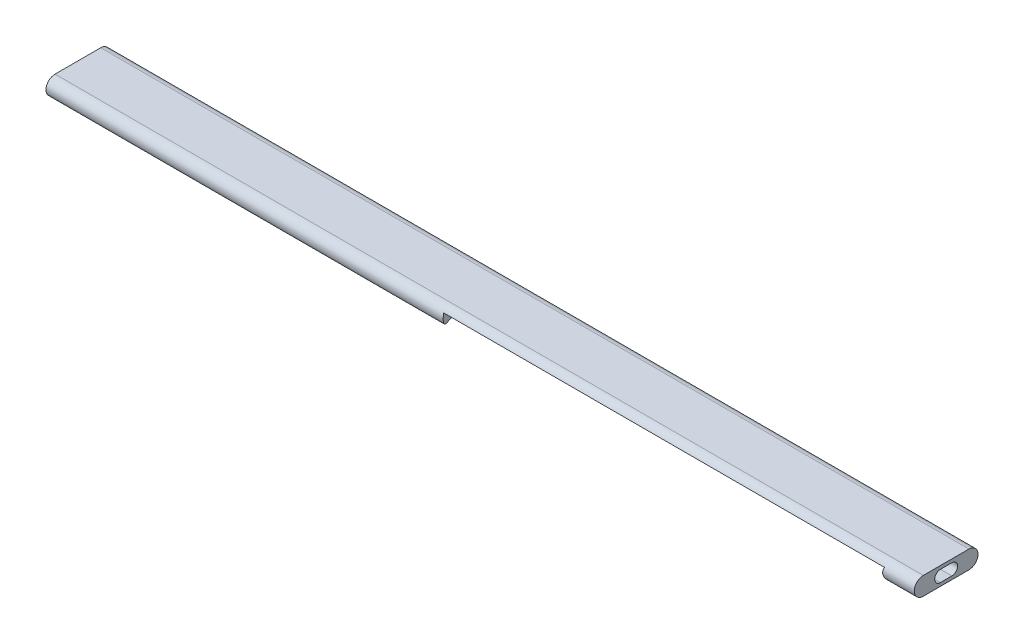
ISO-10303-21;
HEADER;
FILE_DESCRIPTION(('STEP AP214'),'2;1');
FILE_NAME('part.step','',(''),(''),'','','');
FILE_SCHEMA(('AUTOMOTIVE_DESIGN { 1 0 10303 214 1 1 1 1 }'));
ENDSEC;
DATA;
#1=APPLICATION_CONTEXT('core data for automotive mechanical design processes');
#2=APPLICATION_PROTOCOL_DEFINITION('international standard','automotive_design',2000,#1);
#3=PRODUCT_CONTEXT('',#1,'mechanical');
#4=PRODUCT('Part','Part','',(#3));
#5=PRODUCT_RELATED_PRODUCT_CATEGORY('part','',(#4));
#6=PRODUCT_DEFINITION_FORMATION('','',#4);
#7=PRODUCT_DEFINITION_CONTEXT('part definition',#1,'design');
#8=PRODUCT_DEFINITION('design','',#6,#7);
#9=PRODUCT_DEFINITION_SHAPE('','',#8);
#10=(LENGTH_UNIT() NAMED_UNIT(*) SI_UNIT(.MILLI.,.METRE.));
#11=(NAMED_UNIT(*) PLANE_ANGLE_UNIT() SI_UNIT($,.RADIAN.));
#12=(NAMED_UNIT(*) SI_UNIT($,.STERADIAN.) SOLID_ANGLE_UNIT());
#13=UNCERTAINTY_MEASURE_WITH_UNIT(LENGTH_MEASURE(1.E-05),#10,'distance_accuracy_value','');
#14=(GEOMETRIC_REPRESENTATION_CONTEXT(3) GLOBAL_UNCERTAINTY_ASSIGNED_CONTEXT((#13)) GLOBAL_UNIT_ASSIGNED_CONTEXT((#10,
#11,#12)) REPRESENTATION_CONTEXT('',''));
#15=CARTESIAN_POINT('',(0.,0.,0.));
#16=DIRECTION('',(0.,0.,1.));
#17=DIRECTION('',(1.,0.,0.));
#18=AXIS2_PLACEMENT_3D('',#15,#16,#17);
#19=CARTESIAN_POINT('',(380.,-3.95,10.));
#20=DIRECTION('',(0.,1.,0.));
#21=DIRECTION('',(0.,0.,1.));
#22=AXIS2_PLACEMENT_3D('',#19,#20,#21);
#23=PLANE('',#22);
#24=DIRECTION('',(-1.,0.,0.));
#25=VECTOR('',#24,1.);
#26=CARTESIAN_POINT('',(380.,-3.95,-10.));
#27=LINE('',#26,#25);
#28=CARTESIAN_POINT('',(171.899028265928,-3.95,-10.));
#29=VERTEX_POINT('',#28);
#30=CARTESIAN_POINT('',(0.,-3.95,-10.));
#31=VERTEX_POINT('',#30);
#32=EDGE_CURVE('E251',#29,#31,#27,.T.);
#33=ORIENTED_EDGE('',*,*,#32,.F.);
#34=CARTESIAN_POINT('',(197.278769414256,-3.95,0.));
#35=DIRECTION('',(0.,-1.,0.));
#36=DIRECTION('',(0.,0.,-1.));
#37=AXIS2_PLACEMENT_3D('',#34,#35,#36);
#38=CIRCLE('',#37,27.2787694142562);
#39=CARTESIAN_POINT('',(171.899028265928,-3.95,10.));
#40=VERTEX_POINT('',#39);
#41=EDGE_CURVE('E380',#40,#29,#38,.T.);
#42=ORIENTED_EDGE('',*,*,#41,.F.);
#43=DIRECTION('',(-1.,0.,0.));
#44=VECTOR('',#43,1.);
#45=CARTESIAN_POINT('',(380.,-3.95,10.));
#46=LINE('',#45,#44);
#47=CARTESIAN_POINT('',(0.,-3.95,10.));
#48=VERTEX_POINT('',#47);
#49=EDGE_CURVE('E256',#40,#48,#46,.T.);
#50=ORIENTED_EDGE('',*,*,#49,.T.);
#51=DIRECTION('',(0.,0.,-1.));
#52=VECTOR('',#51,1.);
#53=CARTESIAN_POINT('',(0.,-3.95,10.));
#54=LINE('',#53,#52);
#55=EDGE_CURVE('E235',#48,#31,#54,.T.);
#56=ORIENTED_EDGE('',*,*,#55,.T.);
#57=EDGE_LOOP('',(#33,#42,#50,#56));
#58=FACE_BOUND('',#57,.T.);
#59=ADVANCED_FACE('F41',(#58),#23,.F.);
#60=CARTESIAN_POINT('',(390.,-2.5,2.5));
#61=DIRECTION('',(0.,-1.,0.));
#62=DIRECTION('',(0.,0.,-1.));
#63=AXIS2_PLACEMENT_3D('',#60,#61,#62);
#64=PLANE('',#63);
#65=DIRECTION('',(-1.,0.,0.));
#66=VECTOR('',#65,1.);
#67=CARTESIAN_POINT('',(390.,-2.5,2.5));
#68=LINE('',#67,#66);
#69=CARTESIAN_POINT('',(170.11479951374,-2.5,2.5));
#70=VERTEX_POINT('',#69);
#71=CARTESIAN_POINT('',(0.,-2.5,2.5));
#72=VERTEX_POINT('',#71);
#73=EDGE_CURVE('E192',#70,#72,#68,.T.);
#74=ORIENTED_EDGE('',*,*,#73,.F.);
#75=CARTESIAN_POINT('',(197.278769414256,-2.5,0.));
#76=DIRECTION('',(0.,-1.,0.));
#77=DIRECTION('',(0.,0.,-1.));
#78=AXIS2_PLACEMENT_3D('',#75,#76,#77);
#79=CIRCLE('',#78,27.2787694142562);
#80=CARTESIAN_POINT('',(170.11479951374,-2.5,-2.5));
#81=VERTEX_POINT('',#80);
#82=EDGE_CURVE('E421',#70,#81,#79,.T.);
#83=ORIENTED_EDGE('',*,*,#82,.T.);
#84=DIRECTION('',(-1.,0.,0.));
#85=VECTOR('',#84,1.);
#86=CARTESIAN_POINT('',(390.,-2.5,-2.5));
#87=LINE('',#86,#85);
#88=CARTESIAN_POINT('',(0.,-2.5,-2.5));
#89=VERTEX_POINT('',#88);
#90=EDGE_CURVE('E179',#81,#89,#87,.T.);
#91=ORIENTED_EDGE('',*,*,#90,.T.);
#92=DIRECTION('',(0.,0.,1.));
#93=VECTOR('',#92,1.);
#94=CARTESIAN_POINT('',(0.,-2.5,2.5));
#95=LINE('',#94,#93);
#96=EDGE_CURVE('E202',#89,#72,#95,.T.);
#97=ORIENTED_EDGE('',*,*,#96,.T.);
#98=EDGE_LOOP('',(#74,#83,#91,#97));
#99=FACE_BOUND('',#98,.T.);
#100=ADVANCED_FACE('F343',(#99),#64,.F.);
#101=CARTESIAN_POINT('',(380.,0.,10.));
#102=DIRECTION('',(-1.,0.,0.));
#103=DIRECTION('',(0.,0.,1.));
#104=AXIS2_PLACEMENT_3D('',#101,#102,#103);
#105=CYLINDRICAL_SURFACE('',#104,3.95);
#106=ORIENTED_EDGE('',*,*,#49,.F.);
#107=CARTESIAN_POINT('',(171.899028265928,-3.95,10.));
#108=CARTESIAN_POINT('',(171.94674128855,-3.95000523238609,10.1211187317127));
#109=CARTESIAN_POINT('',(171.995330358066,-3.9444295975969,10.2418708423472));
#110=CARTESIAN_POINT('',(172.09385257495,-3.92235600871917,10.4817894590435));
#111=CARTESIAN_POINT('',(172.143785422067,-3.90586047543343,10.6009563105656));
#112=CARTESIAN_POINT('',(172.244596901927,-3.86219139743389,10.8368789028801));
#113=CARTESIAN_POINT('',(172.295475311013,-3.83502034796461,10.9536352003966));
#114=CARTESIAN_POINT('',(172.397734388173,-3.77028231577866,11.183973602497));
#115=CARTESIAN_POINT('',(172.44911508206,-3.73271479602158,11.2975555427724));
#116=CARTESIAN_POINT('',(172.603268953877,-3.6048581027437,11.6323267411303));
#117=CARTESIAN_POINT('',(172.70618488541,-3.4993577519449,11.8478462217603));
#118=CARTESIAN_POINT('',(172.90805457123,-3.25003463468524,12.2577234594721));
#119=CARTESIAN_POINT('',(173.007007293968,-3.10620196465932,12.4520757294727));
#120=CARTESIAN_POINT('',(173.148595003502,-2.86393416580665,12.7230665291524));
#121=CARTESIAN_POINT('',(173.19465826466,-2.77874091426116,12.8099874991171));
#122=CARTESIAN_POINT('',(173.283832055701,-2.59986807857697,12.9762518079893));
#123=CARTESIAN_POINT('',(173.326944016306,-2.50619265828871,13.0555988260325));
#124=CARTESIAN_POINT('',(173.409484945216,-2.31081793716902,13.2059033039564));
#125=CARTESIAN_POINT('',(173.448913762021,-2.20911830659543,13.2768604187676));
#126=CARTESIAN_POINT('',(173.523286880009,-1.99836133711601,13.4094775223418));
#127=CARTESIAN_POINT('',(173.558234101271,-1.88930886053115,13.4711435695308));
#128=CARTESIAN_POINT('',(173.619808669747,-1.67525220266821,13.5789661134543));
#129=CARTESIAN_POINT('',(173.646910845875,-1.57084604376579,13.6260391192927));
#130=CARTESIAN_POINT('',(173.696233608378,-1.35738822948463,13.7112249518945));
#131=CARTESIAN_POINT('',(173.718457073873,-1.24833935956832,13.7493430642301));
#132=CARTESIAN_POINT('',(173.757505518053,-1.02652600246015,13.8160377983434));
#133=CARTESIAN_POINT('',(173.774335379636,-0.913764978513517,13.8446230512974));
#134=CARTESIAN_POINT('',(173.802194670254,-0.685473884069953,13.8918125014772));
#135=CARTESIAN_POINT('',(173.813224980952,-0.569944237260241,13.9104182158278));
#136=CARTESIAN_POINT('',(173.828103657289,-0.353132763202182,13.9354840023348));
#137=CARTESIAN_POINT('',(173.832725444111,-0.252052920902555,13.9432529251376));
#138=CARTESIAN_POINT('',(173.837328262139,-0.0494938539442591,13.9509898848351));
#139=CARTESIAN_POINT('',(173.837309673664,0.0519853373026226,13.9509585610272));
#140=CARTESIAN_POINT('',(173.832629570373,0.254556887831461,13.9430918481801));
#141=CARTESIAN_POINT('',(173.827967130366,0.355649166000116,13.9352549040315));
#142=CARTESIAN_POINT('',(173.814103605482,0.556600384750887,13.9118974939058));
#143=CARTESIAN_POINT('',(173.804902631986,0.656459355537903,13.896377216485));
#144=CARTESIAN_POINT('',(173.771977610466,0.942364868622509,13.8406599668776));
#145=CARTESIAN_POINT('',(173.74261692358,1.12598031674771,13.7907956305916));
#146=CARTESIAN_POINT('',(173.670237902351,1.48142135595335,13.6665133000454));
#147=CARTESIAN_POINT('',(173.627240691102,1.6532646848382,13.5921332738497));
#148=CARTESIAN_POINT('',(173.565496102436,1.86232344651066,13.4837915116853));
#149=CARTESIAN_POINT('',(173.551888908336,1.90645500328914,13.4598365070957));
#150=CARTESIAN_POINT('',(173.537897387161,1.95,13.4351128074635));
#151=B_SPLINE_CURVE_WITH_KNOTS('',3,(#107,#108,#109,#110,#111,#112,#113,#114,#115,#116,#117,
#118,#119,#120,#121,#122,#123,#124,#125,#126,#127,#128,#129,#130,#131,#132,#133,#134,#135,#136,
#137,#138,#139,#140,#141,#142,#143,#144,#145,#146,#147,#148,#149,#150),.UNSPECIFIED.,.F.,.F.,(4,
2,2,2,2,2,2,2,2,2,2,2,2,2,2,2,2,2,2,2,2,4),(0.,0.390380266623746,0.78067401986901,
1.1708766019214,1.56109934405434,2.34054741739185,3.12019706503658,3.51016068812942,
3.89993390741033,4.28972315215218,4.67925711666276,5.03182248534673,5.38417922863565,
5.73621607180816,6.08819938190876,6.39225458123744,6.69628486063289,7.0003757239324,
7.30445912492237,7.87930867721528,8.45327209631667,8.60929695709322),.UNSPECIFIED.);
#152=CARTESIAN_POINT('',(173.537897387161,1.95000000000001,13.4351128074635));
#153=VERTEX_POINT('',#152);
#154=EDGE_CURVE('E319',#40,#153,#151,.T.);
#155=ORIENTED_EDGE('',*,*,#154,.T.);
#156=DIRECTION('',(-1.,0.,0.));
#157=VECTOR('',#156,1.);
#158=CARTESIAN_POINT('',(380.,1.95,13.4351128074635));
#159=LINE('',#158,#157);
#160=CARTESIAN_POINT('',(366.462102612839,1.95000000000001,13.4351128074635));
#161=VERTEX_POINT('',#160);
#162=EDGE_CURVE('E393',#161,#153,#159,.T.);
#163=ORIENTED_EDGE('',*,*,#162,.F.);
#164=CARTESIAN_POINT('',(366.462102612839,1.95000000000001,13.4351128074635));
#165=CARTESIAN_POINT('',(366.435073704957,1.86588388664957,13.4828731469988));
#166=CARTESIAN_POINT('',(366.409494828192,1.77963409448918,13.527738248058));
#167=CARTESIAN_POINT('',(366.361578612178,1.60327956076151,13.6113019665804));
#168=CARTESIAN_POINT('',(366.339242858871,1.51317296084808,13.6499975679514));
#169=CARTESIAN_POINT('',(366.298146183582,1.32944265276328,13.7208596761593));
#170=CARTESIAN_POINT('',(366.27939145948,1.23581317658926,13.7530148693241));
#171=CARTESIAN_POINT('',(366.245829345139,1.0457636207096,13.8103446566376));
#172=CARTESIAN_POINT('',(366.231021295946,0.949344009841717,13.8355204161328));
#173=CARTESIAN_POINT('',(366.205583399831,0.754034448327038,13.8786549722373));
#174=CARTESIAN_POINT('',(366.194966819444,0.655137691045773,13.8965908576739));
#175=CARTESIAN_POINT('',(366.1781854365,0.455853839393729,13.9248986309238));
#176=CARTESIAN_POINT('',(366.172022256645,0.355466215373857,13.9352677616241));
#177=CARTESIAN_POINT('',(366.164288336821,0.154201662419281,13.948274506382));
#178=CARTESIAN_POINT('',(366.162709074199,0.053325991277295,13.9509264686163));
#179=CARTESIAN_POINT('',(366.164151669254,-0.148335340322895,13.9485021958908));
#180=CARTESIAN_POINT('',(366.167175178586,-0.24912095547873,13.9434231867578));
#181=CARTESIAN_POINT('',(366.177514106687,-0.445023680964698,13.9260231875574));
#182=CARTESIAN_POINT('',(366.184619710339,-0.540183388322892,13.9140561795027));
#183=CARTESIAN_POINT('',(366.20281750844,-0.729022741478294,13.883322598727));
#184=CARTESIAN_POINT('',(366.213911108742,-0.822701853161008,13.8645536281507));
#185=CARTESIAN_POINT('',(366.252910775524,-1.10061808898435,13.7983323724339));
#186=CARTESIAN_POINT('',(366.28653975892,-1.28180713459832,13.7409590696802));
#187=CARTESIAN_POINT('',(366.36798918167,-1.63634469988218,13.6003229256638));
#188=CARTESIAN_POINT('',(366.416177873628,-1.80933562983281,13.5163852115264));
#189=CARTESIAN_POINT('',(366.523612957903,-2.13881861765676,13.3262807924677));
#190=CARTESIAN_POINT('',(366.582861294538,-2.29530776688849,13.2201101785392));
#191=CARTESIAN_POINT('',(366.71686563989,-2.60627225633237,12.9754499294513));
#192=CARTESIAN_POINT('',(366.792618414507,-2.75850497213527,12.8346602126917));
#193=CARTESIAN_POINT('',(366.950946655653,-3.0377059674885,12.5332014479548));
#194=CARTESIAN_POINT('',(367.033527074076,-3.16465567845233,12.3725179288019));
#195=CARTESIAN_POINT('',(367.212787564455,-3.4055641509139,12.0141474902066));
#196=CARTESIAN_POINT('',(367.309953736288,-3.51601297042641,11.8143396501289));
#197=CARTESIAN_POINT('',(367.50515092279,-3.70086610720061,11.3991718918987));
#198=CARTESIAN_POINT('',(367.603181578559,-3.77528472604527,11.1838181834862));
#199=CARTESIAN_POINT('',(367.768735941226,-3.87013829253791,10.8066184244436));
#200=CARTESIAN_POINT('',(367.836870375349,-3.8999665659416,10.647344474805));
#201=CARTESIAN_POINT('',(367.970853029373,-3.93988882513124,10.3256238994669));
#202=CARTESIAN_POINT('',(368.0367037941,-3.95000551936335,10.1631811426073));
#203=CARTESIAN_POINT('',(368.100971734072,-3.95,10.));
#204=B_SPLINE_CURVE_WITH_KNOTS('',3,(#164,#165,#166,#167,#168,#169,#170,#171,#172,#173,#174,
#175,#176,#177,#178,#179,#180,#181,#182,#183,#184,#185,#186,#187,#188,#189,#190,#191,#192,#193,
#194,#195,#196,#197,#198,#199,#200,#201,#202,#203),.UNSPECIFIED.,.F.,.F.,(4,2,2,2,2,2,2,2,2,2,2,
2,2,2,2,2,2,2,2,4),(0.,0.30125984151096,0.602666511731834,0.904590205800404,1.20646345766875,
1.5092846605661,1.81221614798948,2.11458404782802,2.41706047461442,2.70522690329465,
2.99349501654463,3.56981363062624,4.1621408044552,4.75457220932242,5.41421497592281,
6.07434043148531,6.81553335892462,7.55643184058619,8.08269749281811,8.60835650883405),.UNSPECIFIED.);
#205=CARTESIAN_POINT('',(368.100971734072,-3.95,10.));
#206=VERTEX_POINT('',#205);
#207=EDGE_CURVE('E296',#161,#206,#204,.T.);
#208=ORIENTED_EDGE('',*,*,#207,.T.);
#209=CARTESIAN_POINT('',(380.,-3.95,10.));
#210=VERTEX_POINT('',#209);
#211=EDGE_CURVE('E164',#210,#206,#46,.T.);
#212=ORIENTED_EDGE('',*,*,#211,.F.);
#213=CARTESIAN_POINT('',(380.,0.,10.));
#214=DIRECTION('',(1.,0.,0.));
#215=DIRECTION('',(0.,0.,-1.));
#216=AXIS2_PLACEMENT_3D('',#213,#214,#215);
#217=CIRCLE('',#216,3.95);
#218=CARTESIAN_POINT('',(380.,3.95,10.));
#219=VERTEX_POINT('',#218);
#220=EDGE_CURVE('E217',#219,#210,#217,.T.);
#221=ORIENTED_EDGE('',*,*,#220,.F.);
#222=DIRECTION('',(-1.,0.,0.));
#223=VECTOR('',#222,1.);
#224=CARTESIAN_POINT('',(380.,3.95,10.));
#225=LINE('',#224,#223);
#226=CARTESIAN_POINT('',(0.,3.95,10.));
#227=VERTEX_POINT('',#226);
#228=EDGE_CURVE('E231',#219,#227,#225,.T.);
#229=ORIENTED_EDGE('',*,*,#228,.T.);
#230=CARTESIAN_POINT('',(0.,0.,10.));
#231=DIRECTION('',(1.,0.,0.));
#232=DIRECTION('',(0.,0.,-1.));
#233=AXIS2_PLACEMENT_3D('',#230,#231,#232);
#234=CIRCLE('',#233,3.95);
#235=EDGE_CURVE('E216',#227,#48,#234,.T.);
#236=ORIENTED_EDGE('',*,*,#235,.T.);
#237=EDGE_LOOP('',(#106,#155,#163,#208,#212,#221,#229,#236));
#238=FACE_BOUND('',#237,.T.);
#239=ADVANCED_FACE('F43',(#238),#105,.T.);
#240=ORIENTED_EDGE('',*,*,#211,.T.);
#241=CARTESIAN_POINT('',(342.721230585744,-3.95,0.));
#242=DIRECTION('',(0.,-1.,0.));
#243=DIRECTION('',(0.,0.,-1.));
#244=AXIS2_PLACEMENT_3D('',#241,#242,#243);
#245=CIRCLE('',#244,27.2787694142562);
#246=CARTESIAN_POINT('',(368.100971734072,-3.95,-10.));
#247=VERTEX_POINT('',#246);
#248=EDGE_CURVE('E413',#247,#206,#245,.T.);
#249=ORIENTED_EDGE('',*,*,#248,.F.);
#250=CARTESIAN_POINT('',(380.,-3.95,-10.));
#251=VERTEX_POINT('',#250);
#252=EDGE_CURVE('E252',#251,#247,#27,.T.);
#253=ORIENTED_EDGE('',*,*,#252,.F.);
#254=DIRECTION('',(0.,0.,-1.));
#255=VECTOR('',#254,1.);
#256=CARTESIAN_POINT('',(380.,-3.95,10.));
#257=LINE('',#256,#255);
#258=EDGE_CURVE('E221',#210,#251,#257,.T.);
#259=ORIENTED_EDGE('',*,*,#258,.F.);
#260=EDGE_LOOP('',(#240,#249,#253,#259));
#261=FACE_BOUND('',#260,.T.);
#262=ADVANCED_FACE('F307',(#261),#23,.F.);
#263=CARTESIAN_POINT('',(380.,0.,-10.));
#264=DIRECTION('',(-1.,0.,0.));
#265=DIRECTION('',(0.,0.,1.));
#266=AXIS2_PLACEMENT_3D('',#263,#264,#265);
#267=CYLINDRICAL_SURFACE('',#266,3.95);
#268=DIRECTION('',(-1.,0.,0.));
#269=VECTOR('',#268,1.);
#270=CARTESIAN_POINT('',(380.,1.95,-13.4351128074635));
#271=LINE('',#270,#269);
#272=CARTESIAN_POINT('',(173.537897387161,1.95000000000001,-13.4351128074635));
#273=VERTEX_POINT('',#272);
#274=CARTESIAN_POINT('',(366.462102612839,1.95000000000001,-13.4351128074635));
#275=VERTEX_POINT('',#274);
#276=EDGE_CURVE('E391',#273,#275,#271,.F.);
#277=ORIENTED_EDGE('',*,*,#276,.F.);
#278=CARTESIAN_POINT('',(173.537897387161,1.95000000000001,-13.4351128074635));
#279=CARTESIAN_POINT('',(173.564926295043,1.86588388664957,-13.4828731469988));
#280=CARTESIAN_POINT('',(173.590505171808,1.77963409448918,-13.527738248058));
#281=CARTESIAN_POINT('',(173.638421387822,1.60327956076151,-13.6113019665804));
#282=CARTESIAN_POINT('',(173.660757141129,1.51317296084808,-13.6499975679514));
#283=CARTESIAN_POINT('',(173.701853816417,1.32944265276329,-13.7208596761593));
#284=CARTESIAN_POINT('',(173.72060854052,1.23581317658927,-13.7530148693241));
#285=CARTESIAN_POINT('',(173.75417065486,1.04576362070961,-13.8103446566376));
#286=CARTESIAN_POINT('',(173.768978704054,0.949344009841729,-13.8355204161328));
#287=CARTESIAN_POINT('',(173.794416600168,0.754034448327047,-13.8786549722373));
#288=CARTESIAN_POINT('',(173.805033180556,0.655137691045781,-13.8965908576739));
#289=CARTESIAN_POINT('',(173.8218145635,0.45585383939374,-13.9248986309238));
#290=CARTESIAN_POINT('',(173.827977743355,0.35546621537387,-13.9352677616241));
#291=CARTESIAN_POINT('',(173.835711663179,0.154201662419298,-13.948274506382));
#292=CARTESIAN_POINT('',(173.837290925801,0.0533259912773122,-13.9509264686163));
#293=CARTESIAN_POINT('',(173.835848330746,-0.148335340322876,-13.9485021958908));
#294=CARTESIAN_POINT('',(173.832824821414,-0.249120955478711,-13.9434231867578));
#295=CARTESIAN_POINT('',(173.822485893313,-0.445023680964676,-13.9260231875574));
#296=CARTESIAN_POINT('',(173.815380289661,-0.540183388322868,-13.9140561795027));
#297=CARTESIAN_POINT('',(173.79718249156,-0.729022741478267,-13.883322598727));
#298=CARTESIAN_POINT('',(173.786088891258,-0.82270185316098,-13.8645536281507));
#299=CARTESIAN_POINT('',(173.747089224476,-1.10061808898433,-13.7983323724339));
#300=CARTESIAN_POINT('',(173.71346024108,-1.2818071345983,-13.7409590696802));
#301=CARTESIAN_POINT('',(173.63201081833,-1.63634469988216,-13.6003229256639));
#302=CARTESIAN_POINT('',(173.583822126372,-1.8093356298328,-13.5163852115264));
#303=CARTESIAN_POINT('',(173.476387042097,-2.13881861765676,-13.3262807924677));
#304=CARTESIAN_POINT('',(173.417138705462,-2.29530776688847,-13.2201101785392));
#305=CARTESIAN_POINT('',(173.28313436011,-2.60627225633234,-12.9754499294513));
#306=CARTESIAN_POINT('',(173.207381585493,-2.75850497213525,-12.8346602126918));
#307=CARTESIAN_POINT('',(173.049053344347,-3.03770596748848,-12.5332014479548));
#308=CARTESIAN_POINT('',(172.966472925924,-3.16465567845232,-12.3725179288019));
#309=CARTESIAN_POINT('',(172.787212435545,-3.40556415091389,-12.0141474902066));
#310=CARTESIAN_POINT('',(172.690046263712,-3.5160129704264,-11.814339650129));
#311=CARTESIAN_POINT('',(172.49484907721,-3.7008661072006,-11.3991718918987));
#312=CARTESIAN_POINT('',(172.396818421441,-3.77528472604526,-11.1838181834863));
#313=CARTESIAN_POINT('',(172.231264058774,-3.8701382925379,-10.8066184244437));
#314=CARTESIAN_POINT('',(172.163129624651,-3.89996656594159,-10.647344474805));
#315=CARTESIAN_POINT('',(172.029146970627,-3.93988882513124,-10.325623899467));
#316=CARTESIAN_POINT('',(171.9632962059,-3.95000551936335,-10.1631811426073));
#317=CARTESIAN_POINT('',(171.899028265928,-3.95,-10.));
#318=B_SPLINE_CURVE_WITH_KNOTS('',3,(#278,#279,#280,#281,#282,#283,#284,#285,#286,#287,#288,
#289,#290,#291,#292,#293,#294,#295,#296,#297,#298,#299,#300,#301,#302,#303,#304,#305,#306,#307,
#308,#309,#310,#311,#312,#313,#314,#315,#316,#317),.UNSPECIFIED.,.F.,.F.,(4,2,2,2,2,2,2,2,2,2,2,
2,2,2,2,2,2,2,2,4),(0.,0.301259841510969,0.602666511731825,0.904590205800389,1.20646345766874,
1.50928466056609,1.81221614798947,2.114584047828,2.4170604746144,2.70522690329462,
2.99349501654459,3.56981363062622,4.16214080445518,4.75457220932241,5.41421497592278,
6.07434043148528,6.81553335892459,7.55643184058615,8.08269749281808,8.60835650883403),.UNSPECIFIED.);
#319=EDGE_CURVE('E170',#273,#29,#318,.T.);
#320=ORIENTED_EDGE('',*,*,#319,.T.);
#321=ORIENTED_EDGE('',*,*,#32,.T.);
#322=CARTESIAN_POINT('',(0.,0.,-10.));
#323=DIRECTION('',(1.,0.,0.));
#324=DIRECTION('',(0.,0.,-1.));
#325=AXIS2_PLACEMENT_3D('',#322,#323,#324);
#326=CIRCLE('',#325,3.95);
#327=CARTESIAN_POINT('',(0.,3.95,-10.));
#328=VERTEX_POINT('',#327);
#329=EDGE_CURVE('E239',#31,#328,#326,.T.);
#330=ORIENTED_EDGE('',*,*,#329,.T.);
#331=DIRECTION('',(-1.,0.,0.));
#332=VECTOR('',#331,1.);
#333=CARTESIAN_POINT('',(380.,3.95,-10.));
#334=LINE('',#333,#332);
#335=CARTESIAN_POINT('',(380.,3.95,-10.));
#336=VERTEX_POINT('',#335);
#337=EDGE_CURVE('E247',#336,#328,#334,.T.);
#338=ORIENTED_EDGE('',*,*,#337,.F.);
#339=CARTESIAN_POINT('',(380.,0.,-10.));
#340=DIRECTION('',(1.,0.,0.));
#341=DIRECTION('',(0.,0.,-1.));
#342=AXIS2_PLACEMENT_3D('',#339,#340,#341);
#343=CIRCLE('',#342,3.95);
#344=EDGE_CURVE('E225',#251,#336,#343,.T.);
#345=ORIENTED_EDGE('',*,*,#344,.F.);
#346=ORIENTED_EDGE('',*,*,#252,.T.);
#347=CARTESIAN_POINT('',(368.100971734072,-3.95,-10.));
#348=CARTESIAN_POINT('',(368.05325871145,-3.95000523238608,-10.1211187317127));
#349=CARTESIAN_POINT('',(368.004669641934,-3.9444295975969,-10.2418708423473));
#350=CARTESIAN_POINT('',(367.90614742505,-3.92235600871916,-10.4817894590435));
#351=CARTESIAN_POINT('',(367.856214577933,-3.90586047543342,-10.6009563105656));
#352=CARTESIAN_POINT('',(367.755403098073,-3.86219139743388,-10.8368789028801));
#353=CARTESIAN_POINT('',(367.704524688987,-3.8350203479646,-10.9536352003966));
#354=CARTESIAN_POINT('',(367.602265611827,-3.77028231577865,-11.183973602497));
#355=CARTESIAN_POINT('',(367.55088491794,-3.73271479602157,-11.2975555427724));
#356=CARTESIAN_POINT('',(367.396731046123,-3.60485810274369,-11.6323267411303));
#357=CARTESIAN_POINT('',(367.29381511459,-3.49935775194487,-11.8478462217604));
#358=CARTESIAN_POINT('',(367.09194542877,-3.25003463468521,-12.2577234594721));
#359=CARTESIAN_POINT('',(366.992992706032,-3.1062019646593,-12.4520757294727));
#360=CARTESIAN_POINT('',(366.851404996498,-2.86393416580664,-12.7230665291524));
#361=CARTESIAN_POINT('',(366.80534173534,-2.77874091426115,-12.8099874991171));
#362=CARTESIAN_POINT('',(366.716167944299,-2.59986807857696,-12.9762518079893));
#363=CARTESIAN_POINT('',(366.673055983694,-2.50619265828871,-13.0555988260325));
#364=CARTESIAN_POINT('',(366.590515054784,-2.31081793716902,-13.2059033039564));
#365=CARTESIAN_POINT('',(366.551086237979,-2.20911830659543,-13.2768604187676));
#366=CARTESIAN_POINT('',(366.476713119991,-1.998361337116,-13.4094775223418));
#367=CARTESIAN_POINT('',(366.441765898729,-1.88930886053114,-13.4711435695308));
#368=CARTESIAN_POINT('',(366.380191330253,-1.67525220266821,-13.5789661134543));
#369=CARTESIAN_POINT('',(366.353089154125,-1.57084604376578,-13.6260391192927));
#370=CARTESIAN_POINT('',(366.303766391622,-1.35738822948462,-13.7112249518945));
#371=CARTESIAN_POINT('',(366.281542926127,-1.24833935956831,-13.7493430642301));
#372=CARTESIAN_POINT('',(366.242494481947,-1.02652600246015,-13.8160377983434));
#373=CARTESIAN_POINT('',(366.225664620364,-0.913764978513512,-13.8446230512974));
#374=CARTESIAN_POINT('',(366.197805329746,-0.685473884069947,-13.8918125014772));
#375=CARTESIAN_POINT('',(366.186775019048,-0.569944237260232,-13.9104182158278));
#376=CARTESIAN_POINT('',(366.171896342711,-0.353132763202171,-13.9354840023348));
#377=CARTESIAN_POINT('',(366.167274555889,-0.252052920902544,-13.9432529251376));
#378=CARTESIAN_POINT('',(366.162671737861,-0.0494938539442475,-13.9509898848351));
#379=CARTESIAN_POINT('',(366.162690326336,0.051985337302635,-13.9509585610272));
#380=CARTESIAN_POINT('',(366.167370429627,0.254556887831472,-13.9430918481801));
#381=CARTESIAN_POINT('',(366.172032869634,0.355649166000126,-13.9352549040315));
#382=CARTESIAN_POINT('',(366.185896394518,0.556600384750898,-13.9118974939058));
#383=CARTESIAN_POINT('',(366.195097368014,0.656459355537918,-13.896377216485));
#384=CARTESIAN_POINT('',(366.228022389534,0.942364868622525,-13.8406599668776));
#385=CARTESIAN_POINT('',(366.25738307642,1.12598031674772,-13.7907956305916));
#386=CARTESIAN_POINT('',(366.329762097649,1.48142135595336,-13.6665133000454));
#387=CARTESIAN_POINT('',(366.372759308898,1.65326468483822,-13.5921332738497));
#388=CARTESIAN_POINT('',(366.434503897564,1.86232344651067,-13.4837915116853));
#389=CARTESIAN_POINT('',(366.448111091664,1.90645500328916,-13.4598365070957));
#390=CARTESIAN_POINT('',(366.462102612839,1.95000000000001,-13.4351128074635));
#391=B_SPLINE_CURVE_WITH_KNOTS('',3,(#347,#348,#349,#350,#351,#352,#353,#354,#355,#356,#357,
#358,#359,#360,#361,#362,#363,#364,#365,#366,#367,#368,#369,#370,#371,#372,#373,#374,#375,#376,
#377,#378,#379,#380,#381,#382,#383,#384,#385,#386,#387,#388,#389,#390),.UNSPECIFIED.,.F.,.F.,(4,
2,2,2,2,2,2,2,2,2,2,2,2,2,2,2,2,2,2,2,2,4),(0.,0.390380266623766,0.780674019869029,
1.17087660192143,1.56109934405436,2.34054741739194,3.12019706503657,3.51016068812944,
3.89993390741032,4.28972315215217,4.67925711666276,5.03182248534673,5.38417922863565,
5.73621607180816,6.08819938190876,6.39225458123744,6.6962848606329,7.0003757239324,
7.30445912492237,7.87930867721529,8.45327209631667,8.60929695709321),.UNSPECIFIED.);
#392=EDGE_CURVE('E288',#247,#275,#391,.T.);
#393=ORIENTED_EDGE('',*,*,#392,.T.);
#394=EDGE_LOOP('',(#277,#320,#321,#330,#338,#345,#346,#393));
#395=FACE_BOUND('',#394,.T.);
#396=ADVANCED_FACE('F302',(#395),#267,.T.);
#397=CARTESIAN_POINT('',(380.,3.95,10.));
#398=DIRECTION('',(0.,-1.,0.));
#399=DIRECTION('',(0.,0.,-1.));
#400=AXIS2_PLACEMENT_3D('',#397,#398,#399);
#401=PLANE('',#400);
#402=DIRECTION('',(0.,0.,1.));
#403=VECTOR('',#402,1.);
#404=CARTESIAN_POINT('',(0.,3.95,10.));
#405=LINE('',#404,#403);
#406=EDGE_CURVE('E222',#328,#227,#405,.T.);
#407=ORIENTED_EDGE('',*,*,#406,.T.);
#408=ORIENTED_EDGE('',*,*,#228,.F.);
#409=DIRECTION('',(0.,0.,1.));
#410=VECTOR('',#409,1.);
#411=CARTESIAN_POINT('',(380.,3.95,10.));
#412=LINE('',#411,#410);
#413=EDGE_CURVE('E228',#336,#219,#412,.T.);
#414=ORIENTED_EDGE('',*,*,#413,.F.);
#415=ORIENTED_EDGE('',*,*,#337,.T.);
#416=EDGE_LOOP('',(#407,#408,#414,#415));
#417=FACE_BOUND('',#416,.T.);
#418=ADVANCED_FACE('F306',(#417),#401,.F.);
#419=CARTESIAN_POINT('',(380.,0.,10.));
#420=DIRECTION('',(1.,0.,0.));
#421=DIRECTION('',(0.,0.,-1.));
#422=AXIS2_PLACEMENT_3D('',#419,#420,#421);
#423=PLANE('',#422);
#424=CARTESIAN_POINT('',(380.,0.,2.5));
#425=DIRECTION('',(1.,0.,0.));
#426=DIRECTION('',(0.,0.,-1.));
#427=AXIS2_PLACEMENT_3D('',#424,#425,#426);
#428=CIRCLE('',#427,2.5);
#429=CARTESIAN_POINT('',(380.,2.5,2.5));
#430=VERTEX_POINT('',#429);
#431=CARTESIAN_POINT('',(380.,-2.5,2.5));
#432=VERTEX_POINT('',#431);
#433=EDGE_CURVE('E213',#430,#432,#428,.T.);
#434=ORIENTED_EDGE('',*,*,#433,.F.);
#435=DIRECTION('',(0.,0.,1.));
#436=VECTOR('',#435,1.);
#437=CARTESIAN_POINT('',(380.,2.5,10.));
#438=LINE('',#437,#436);
#439=CARTESIAN_POINT('',(380.,2.5,-2.5));
#440=VERTEX_POINT('',#439);
#441=EDGE_CURVE('E203',#440,#430,#438,.T.);
#442=ORIENTED_EDGE('',*,*,#441,.F.);
#443=CARTESIAN_POINT('',(380.,0.,-2.5));
#444=DIRECTION('',(1.,0.,0.));
#445=DIRECTION('',(0.,0.,-1.));
#446=AXIS2_PLACEMENT_3D('',#443,#444,#445);
#447=CIRCLE('',#446,2.5);
#448=CARTESIAN_POINT('',(380.,-2.5,-2.5));
#449=VERTEX_POINT('',#448);
#450=EDGE_CURVE('E206',#449,#440,#447,.T.);
#451=ORIENTED_EDGE('',*,*,#450,.F.);
#452=DIRECTION('',(0.,0.,-1.));
#453=VECTOR('',#452,1.);
#454=CARTESIAN_POINT('',(380.,-2.5,10.));
#455=LINE('',#454,#453);
#456=EDGE_CURVE('E210',#432,#449,#455,.T.);
#457=ORIENTED_EDGE('',*,*,#456,.F.);
#458=EDGE_LOOP('',(#434,#442,#451,#457));
#459=FACE_BOUND('',#458,.T.);
#460=ORIENTED_EDGE('',*,*,#220,.T.);
#461=ORIENTED_EDGE('',*,*,#258,.T.);
#462=ORIENTED_EDGE('',*,*,#344,.T.);
#463=ORIENTED_EDGE('',*,*,#413,.T.);
#464=EDGE_LOOP('',(#460,#461,#462,#463));
#465=FACE_BOUND('',#464,.T.);
#466=ADVANCED_FACE('F359',(#459,#465),#423,.T.);
#467=CARTESIAN_POINT('',(0.,0.,10.));
#468=DIRECTION('',(1.,0.,0.));
#469=DIRECTION('',(0.,0.,-1.));
#470=AXIS2_PLACEMENT_3D('',#467,#468,#469);
#471=PLANE('',#470);
#472=DIRECTION('',(0.,0.,-1.));
#473=VECTOR('',#472,1.);
#474=CARTESIAN_POINT('',(0.,2.5,2.5));
#475=LINE('',#474,#473);
#476=CARTESIAN_POINT('',(0.,2.5,2.5));
#477=VERTEX_POINT('',#476);
#478=CARTESIAN_POINT('',(0.,2.5,-2.5));
#479=VERTEX_POINT('',#478);
#480=EDGE_CURVE('E335',#477,#479,#475,.T.);
#481=ORIENTED_EDGE('',*,*,#480,.F.);
#482=CARTESIAN_POINT('',(0.,0.,2.5));
#483=DIRECTION('',(-1.,0.,0.));
#484=DIRECTION('',(0.,0.,1.));
#485=AXIS2_PLACEMENT_3D('',#482,#483,#484);
#486=CIRCLE('',#485,2.5);
#487=EDGE_CURVE('E332',#72,#477,#486,.T.);
#488=ORIENTED_EDGE('',*,*,#487,.F.);
#489=ORIENTED_EDGE('',*,*,#96,.F.);
#490=CARTESIAN_POINT('',(0.,0.,-2.5));
#491=DIRECTION('',(-1.,0.,0.));
#492=DIRECTION('',(0.,0.,1.));
#493=AXIS2_PLACEMENT_3D('',#490,#491,#492);
#494=CIRCLE('',#493,2.5);
#495=EDGE_CURVE('E181',#479,#89,#494,.T.);
#496=ORIENTED_EDGE('',*,*,#495,.F.);
#497=EDGE_LOOP('',(#481,#488,#489,#496));
#498=FACE_BOUND('',#497,.T.);
#499=ORIENTED_EDGE('',*,*,#235,.F.);
#500=ORIENTED_EDGE('',*,*,#406,.F.);
#501=ORIENTED_EDGE('',*,*,#329,.F.);
#502=ORIENTED_EDGE('',*,*,#55,.F.);
#503=EDGE_LOOP('',(#499,#500,#501,#502));
#504=FACE_BOUND('',#503,.T.);
#505=ADVANCED_FACE('F346',(#498,#504),#471,.F.);
#506=CARTESIAN_POINT('',(390.,0.,2.5));
#507=DIRECTION('',(-1.,0.,0.));
#508=DIRECTION('',(0.,0.,1.));
#509=AXIS2_PLACEMENT_3D('',#506,#507,#508);
#510=CYLINDRICAL_SURFACE('',#509,2.5);
#511=DIRECTION('',(-1.,0.,0.));
#512=VECTOR('',#511,1.);
#513=CARTESIAN_POINT('',(390.,1.95,4.0644487847162));
#514=LINE('',#513,#512);
#515=CARTESIAN_POINT('',(170.30449432052,1.95000000000001,4.0644487847162));
#516=VERTEX_POINT('',#515);
#517=CARTESIAN_POINT('',(369.69550567948,1.95000000000001,4.0644487847162));
#518=VERTEX_POINT('',#517);
#519=EDGE_CURVE('E173',#516,#518,#514,.F.);
#520=ORIENTED_EDGE('',*,*,#519,.F.);
#521=CARTESIAN_POINT('',(170.30449432052,1.95000000000001,4.06444878471619));
#522=CARTESIAN_POINT('',(170.312735682314,1.90611598904194,4.11914600494327));
#523=CARTESIAN_POINT('',(170.320867381618,1.85994348113145,4.17198136651587));
#524=CARTESIAN_POINT('',(170.336792560506,1.76329612459643,4.27361506366697));
#525=CARTESIAN_POINT('',(170.344586034416,1.71282120384846,4.32241333154266));
#526=CARTESIAN_POINT('',(170.367265760088,1.55545843226576,4.46218988280483));
#527=CARTESIAN_POINT('',(170.381467678085,1.44254681655901,4.54665667013422));
#528=CARTESIAN_POINT('',(170.407062381104,1.20386957388986,4.69556920084272));
#529=CARTESIAN_POINT('',(170.418452925565,1.07809380685268,4.7599989860353));
#530=CARTESIAN_POINT('',(170.437603301795,0.817286489515317,4.86682860411321));
#531=CARTESIAN_POINT('',(170.445364736011,0.682259054577891,4.90923816102739));
#532=CARTESIAN_POINT('',(170.456623153293,0.408295105338551,4.97038208974476));
#533=CARTESIAN_POINT('',(170.460164788213,0.269415729630704,4.9893644352118));
#534=CARTESIAN_POINT('',(170.462869604211,-0.00962980421574739,5.00388213114154));
#535=CARTESIAN_POINT('',(170.462032208991,-0.14979612929912,4.99941439547479));
#536=CARTESIAN_POINT('',(170.456071436118,-0.425904175526209,4.96733213687316));
#537=CARTESIAN_POINT('',(170.450991766113,-0.561874374040078,4.93995365487946));
#538=CARTESIAN_POINT('',(170.436974234527,-0.827236758077521,4.86320887230885));
#539=CARTESIAN_POINT('',(170.428036565749,-0.956629271960447,4.81384367051673));
#540=CARTESIAN_POINT('',(170.406880788294,-1.20590433616154,4.69430992737422));
#541=CARTESIAN_POINT('',(170.394646839906,-1.32573724794322,4.62404076124209));
#542=CARTESIAN_POINT('',(170.367747749717,-1.55196469058919,4.4648260198266));
#543=CARTESIAN_POINT('',(170.353082469081,-1.65835845343171,4.37587937793372));
#544=CARTESIAN_POINT('',(170.322032615504,-1.85633535456044,4.18037306862678));
#545=CARTESIAN_POINT('',(170.305626182352,-1.94768117796629,4.07357655249501));
#546=CARTESIAN_POINT('',(170.272270772664,-2.11122761789426,3.84622813051304));
#547=CARTESIAN_POINT('',(170.255321604157,-2.18342137437967,3.72567131794719));
#548=CARTESIAN_POINT('',(170.22165700063,-2.307314382817,3.47280426537281));
#549=CARTESIAN_POINT('',(170.204946031835,-2.35878516389392,3.34038168597491));
#550=CARTESIAN_POINT('',(170.172811029199,-2.43855755055587,3.06869710124822));
#551=CARTESIAN_POINT('',(170.157385119242,-2.46689348360991,2.9294455554082));
#552=CARTESIAN_POINT('',(170.138007503667,-2.48883518546855,2.74092299065879));
#553=CARTESIAN_POINT('',(170.133191445425,-2.49302297408848,2.69280764554062));
#554=CARTESIAN_POINT('',(170.123808151852,-2.49860172594516,2.59647229221184));
#555=CARTESIAN_POINT('',(170.119240514268,-2.49999734999474,2.54825259314855));
#556=CARTESIAN_POINT('',(170.11479951374,-2.5,2.5));
#557=B_SPLINE_CURVE_WITH_KNOTS('',3,(#521,#522,#523,#524,#525,#526,#527,#528,#529,#530,#531,
#532,#533,#534,#535,#536,#537,#538,#539,#540,#541,#542,#543,#544,#545,#546,#547,#548,#549,#550,
#551,#552,#553,#554,#555,#556),.UNSPECIFIED.,.F.,.F.,(4,2,2,2,2,2,2,2,2,2,2,2,2,2,2,2,2,4),(0.,
0.211696940603534,0.42339743068428,0.84638988949358,1.26971837696744,1.69285976524868,
2.11148274643236,2.53016082154491,2.94457776921678,3.35897400875404,3.77539821366604,
4.19184620567249,4.61433715038948,5.03697922250491,5.46416109392734,5.89070795534564,
6.03625831143783,6.18156550461671),.UNSPECIFIED.);
#558=EDGE_CURVE('E320',#516,#70,#557,.T.);
#559=ORIENTED_EDGE('',*,*,#558,.T.);
#560=ORIENTED_EDGE('',*,*,#73,.T.);
#561=ORIENTED_EDGE('',*,*,#487,.T.);
#562=DIRECTION('',(-1.,0.,0.));
#563=VECTOR('',#562,1.);
#564=CARTESIAN_POINT('',(390.,2.5,2.5));
#565=LINE('',#564,#563);
#566=EDGE_CURVE('E193',#430,#477,#565,.T.);
#567=ORIENTED_EDGE('',*,*,#566,.F.);
#568=ORIENTED_EDGE('',*,*,#433,.T.);
#569=CARTESIAN_POINT('',(369.88520048626,-2.5,2.5));
#570=VERTEX_POINT('',#569);
#571=EDGE_CURVE('E196',#432,#570,#68,.T.);
#572=ORIENTED_EDGE('',*,*,#571,.T.);
#573=CARTESIAN_POINT('',(369.88520048626,-2.5,2.5));
#574=CARTESIAN_POINT('',(369.878691280701,-2.50000669130583,2.57075574330113));
#575=CARTESIAN_POINT('',(369.871900726663,-2.49699623427627,2.64148108627104));
#576=CARTESIAN_POINT('',(369.85782325246,-2.48500656353339,2.78236808995822));
#577=CARTESIAN_POINT('',(369.850536377186,-2.47602788898603,2.85252980101431));
#578=CARTESIAN_POINT('',(369.835537952127,-2.45217773312621,2.99173872987611));
#579=CARTESIAN_POINT('',(369.827826779263,-2.43731141154964,3.06078686858449));
#580=CARTESIAN_POINT('',(369.812061217361,-2.40181595211312,3.19732535147188));
#581=CARTESIAN_POINT('',(369.804006828256,-2.38118681312344,3.26481569534549));
#582=CARTESIAN_POINT('',(369.779462273744,-2.31084447928501,3.46427833329703));
#583=CARTESIAN_POINT('',(369.762581118314,-2.25266114375393,3.59333047368969));
#584=CARTESIAN_POINT('',(369.72870116142,-2.11544488863521,3.83970254808045));
#585=CARTESIAN_POINT('',(369.711702370437,-2.03641380379874,3.95702351325355));
#586=CARTESIAN_POINT('',(369.678504841729,-1.8593000013158,4.17720911137664));
#587=CARTESIAN_POINT('',(369.662309479205,-1.76114425472434,4.28001563884339));
#588=CARTESIAN_POINT('',(369.631828416702,-1.54867031772444,4.46766731156774));
#589=CARTESIAN_POINT('',(369.617542912154,-1.43435047573752,4.55251061920495));
#590=CARTESIAN_POINT('',(369.591934014743,-1.19340016546381,4.70130263391789));
#591=CARTESIAN_POINT('',(369.580594892021,-1.06684023719571,4.76536277239693));
#592=CARTESIAN_POINT('',(369.561594637799,-0.804486710849929,4.87124541193391));
#593=CARTESIAN_POINT('',(369.553932963918,-0.668694477800641,4.9130711923893));
#594=CARTESIAN_POINT('',(369.542941610082,-0.393849766345057,4.97272495163371));
#595=CARTESIAN_POINT('',(369.539550314963,-0.254873835128166,4.99089438947315));
#596=CARTESIAN_POINT('',(369.537148999009,0.0241904099467988,5.00378129150061));
#597=CARTESIAN_POINT('',(369.538138541255,0.164278611482916,4.99850109440968));
#598=CARTESIAN_POINT('',(369.544391170535,0.440109257967529,4.96483620894814));
#599=CARTESIAN_POINT('',(369.549611134775,0.575881254740881,4.93668465257431));
#600=CARTESIAN_POINT('',(369.563892998064,0.840774992919,4.85842588581108));
#601=CARTESIAN_POINT('',(369.572956100494,0.969894637093418,4.80831179824609));
#602=CARTESIAN_POINT('',(369.59434399067,1.21858342156796,4.68730435214951));
#603=CARTESIAN_POINT('',(369.606686996725,1.33809420393175,4.61629468438877));
#604=CARTESIAN_POINT('',(369.633768448707,1.56345083501388,4.45568720380247));
#605=CARTESIAN_POINT('',(369.64850366593,1.66931476174925,4.36611440070372));
#606=CARTESIAN_POINT('',(369.669077411092,1.79930911438037,4.23625901105168));
#607=CARTESIAN_POINT('',(369.674283909298,1.8307995419469,4.20301885892984));
#608=CARTESIAN_POINT('',(369.684813276853,1.89184633774632,4.13493076339971));
#609=CARTESIAN_POINT('',(369.690135927894,1.92140597671191,4.10008571895122));
#610=CARTESIAN_POINT('',(369.69550567948,1.95000000000002,4.06444878471621));
#611=B_SPLINE_CURVE_WITH_KNOTS('',3,(#573,#574,#575,#576,#577,#578,#579,#580,#581,#582,#583,
#584,#585,#586,#587,#588,#589,#590,#591,#592,#593,#594,#595,#596,#597,#598,#599,#600,#601,#602,
#603,#604,#605,#606,#607,#608,#609,#610),.UNSPECIFIED.,.F.,.F.,(4,2,2,2,2,2,2,2,2,2,2,2,2,2,2,2,
2,2,4),(0.,0.213091592190615,0.426163936402709,0.639049962916725,0.851936031164538,
1.27744138804016,1.70290930988435,2.13003493279946,2.55720422917217,2.98204382953902,
3.40682075192208,3.8253958057352,4.24392911440781,4.65824897678035,5.07269866884187,
5.48950037976103,5.9057441510948,6.04394438992027,6.18190409898238),.UNSPECIFIED.);
#612=EDGE_CURVE('E280',#570,#518,#611,.T.);
#613=ORIENTED_EDGE('',*,*,#612,.T.);
#614=EDGE_LOOP('',(#520,#559,#560,#561,#567,#568,#572,#613));
#615=FACE_BOUND('',#614,.T.);
#616=ADVANCED_FACE('F351',(#615),#510,.F.);
#617=CARTESIAN_POINT('',(369.88520048626,-2.5,-2.5));
#618=VERTEX_POINT('',#617);
#619=EDGE_CURVE('E186',#449,#618,#87,.T.);
#620=ORIENTED_EDGE('',*,*,#619,.T.);
#621=CARTESIAN_POINT('',(342.721230585744,-2.5,0.));
#622=DIRECTION('',(0.,-1.,0.));
#623=DIRECTION('',(0.,0.,-1.));
#624=AXIS2_PLACEMENT_3D('',#621,#622,#623);
#625=CIRCLE('',#624,27.2787694142562);
#626=EDGE_CURVE('E369',#618,#570,#625,.T.);
#627=ORIENTED_EDGE('',*,*,#626,.T.);
#628=ORIENTED_EDGE('',*,*,#571,.F.);
#629=ORIENTED_EDGE('',*,*,#456,.T.);
#630=EDGE_LOOP('',(#620,#627,#628,#629));
#631=FACE_BOUND('',#630,.T.);
#632=ADVANCED_FACE('F367',(#631),#64,.F.);
#633=CARTESIAN_POINT('',(390.,0.,-2.5));
#634=DIRECTION('',(-1.,0.,0.));
#635=DIRECTION('',(0.,0.,1.));
#636=AXIS2_PLACEMENT_3D('',#633,#634,#635);
#637=CYLINDRICAL_SURFACE('',#636,2.5);
#638=ORIENTED_EDGE('',*,*,#90,.F.);
#639=CARTESIAN_POINT('',(170.11479951374,-2.5,-2.5));
#640=CARTESIAN_POINT('',(170.121308719299,-2.50000669130583,-2.57075574330113));
#641=CARTESIAN_POINT('',(170.128099273337,-2.49699623427627,-2.64148108627104));
#642=CARTESIAN_POINT('',(170.14217674754,-2.48500656353339,-2.78236808995822));
#643=CARTESIAN_POINT('',(170.149463622814,-2.47602788898603,-2.85252980101432));
#644=CARTESIAN_POINT('',(170.164462047873,-2.45217773312621,-2.99173872987611));
#645=CARTESIAN_POINT('',(170.172173220737,-2.43731141154964,-3.06078686858449));
#646=CARTESIAN_POINT('',(170.187938782639,-2.40181595211312,-3.19732535147188));
#647=CARTESIAN_POINT('',(170.195993171744,-2.38118681312344,-3.26481569534549));
#648=CARTESIAN_POINT('',(170.220537726256,-2.31084447928502,-3.46427833329703));
#649=CARTESIAN_POINT('',(170.237418881686,-2.25266114375394,-3.59333047368969));
#650=CARTESIAN_POINT('',(170.27129883858,-2.11544488863521,-3.83970254808045));
#651=CARTESIAN_POINT('',(170.288297629563,-2.03641380379874,-3.95702351325355));
#652=CARTESIAN_POINT('',(170.321495158271,-1.8593000013158,-4.17720911137664));
#653=CARTESIAN_POINT('',(170.337690520795,-1.76114425472434,-4.28001563884339));
#654=CARTESIAN_POINT('',(170.368171583298,-1.54867031772444,-4.46766731156775));
#655=CARTESIAN_POINT('',(170.382457087846,-1.43435047573752,-4.55251061920495));
#656=CARTESIAN_POINT('',(170.408065985257,-1.19340016546381,-4.70130263391789));
#657=CARTESIAN_POINT('',(170.419405107979,-1.06684023719572,-4.76536277239693));
#658=CARTESIAN_POINT('',(170.438405362201,-0.804486710849933,-4.87124541193391));
#659=CARTESIAN_POINT('',(170.446067036082,-0.668694477800644,-4.9130711923893));
#660=CARTESIAN_POINT('',(170.457058389918,-0.393849766345058,-4.97272495163371));
#661=CARTESIAN_POINT('',(170.460449685037,-0.254873835128168,-4.99089438947315));
#662=CARTESIAN_POINT('',(170.462851000991,0.024190409946796,-5.00378129150061));
#663=CARTESIAN_POINT('',(170.461861458745,0.164278611482913,-4.99850109440968));
#664=CARTESIAN_POINT('',(170.455608829465,0.440109257967525,-4.96483620894814));
#665=CARTESIAN_POINT('',(170.450388865225,0.575881254740879,-4.93668465257431));
#666=CARTESIAN_POINT('',(170.436107001936,0.840774992918998,-4.85842588581108));
#667=CARTESIAN_POINT('',(170.427043899506,0.969894637093414,-4.80831179824609));
#668=CARTESIAN_POINT('',(170.40565600933,1.21858342156795,-4.68730435214951));
#669=CARTESIAN_POINT('',(170.393313003275,1.33809420393174,-4.61629468438877));
#670=CARTESIAN_POINT('',(170.366231551293,1.56345083501388,-4.45568720380247));
#671=CARTESIAN_POINT('',(170.35149633407,1.66931476174925,-4.36611440070372));
#672=CARTESIAN_POINT('',(170.330922588908,1.79930911438036,-4.23625901105169));
#673=CARTESIAN_POINT('',(170.325716090702,1.8307995419469,-4.20301885892984));
#674=CARTESIAN_POINT('',(170.315186723147,1.89184633774632,-4.13493076339971));
#675=CARTESIAN_POINT('',(170.309864072106,1.9214059767119,-4.10008571895122));
#676=CARTESIAN_POINT('',(170.30449432052,1.95000000000002,-4.0644487847162));
#677=B_SPLINE_CURVE_WITH_KNOTS('',3,(#639,#640,#641,#642,#643,#644,#645,#646,#647,#648,#649,
#650,#651,#652,#653,#654,#655,#656,#657,#658,#659,#660,#661,#662,#663,#664,#665,#666,#667,#668,
#669,#670,#671,#672,#673,#674,#675,#676),.UNSPECIFIED.,.F.,.F.,(4,2,2,2,2,2,2,2,2,2,2,2,2,2,2,2,
2,2,4),(0.,0.213091592190617,0.426163936402714,0.639049962916729,0.851936031164537,
1.27744138804015,1.70290930988435,2.13003493279946,2.55720422917217,2.98204382953901,
3.40682075192208,3.8253958057352,4.2439291144078,4.65824897678035,5.07269866884186,
5.48950037976103,5.9057441510948,6.04394438992027,6.18190409898239),.UNSPECIFIED.);
#678=CARTESIAN_POINT('',(170.30449432052,1.95000000000001,-4.0644487847162));
#679=VERTEX_POINT('',#678);
#680=EDGE_CURVE('E12',#81,#679,#677,.T.);
#681=ORIENTED_EDGE('',*,*,#680,.T.);
#682=DIRECTION('',(-1.,0.,0.));
#683=VECTOR('',#682,1.);
#684=CARTESIAN_POINT('',(390.,1.95,-4.0644487847162));
#685=LINE('',#684,#683);
#686=CARTESIAN_POINT('',(369.69550567948,1.95000000000001,-4.0644487847162));
#687=VERTEX_POINT('',#686);
#688=EDGE_CURVE('E159',#687,#679,#685,.T.);
#689=ORIENTED_EDGE('',*,*,#688,.F.);
#690=CARTESIAN_POINT('',(369.69550567948,1.95000000000001,-4.06444878471619));
#691=CARTESIAN_POINT('',(369.687264317687,1.90611598904194,-4.11914600494327));
#692=CARTESIAN_POINT('',(369.679132618382,1.85994348113144,-4.17198136651588));
#693=CARTESIAN_POINT('',(369.663207439494,1.76329612459643,-4.27361506366697));
#694=CARTESIAN_POINT('',(369.655413965584,1.71282120384846,-4.32241333154266));
#695=CARTESIAN_POINT('',(369.632734239912,1.55545843226576,-4.46218988280483));
#696=CARTESIAN_POINT('',(369.618532321915,1.44254681655901,-4.54665667013422));
#697=CARTESIAN_POINT('',(369.592937618896,1.20386957388986,-4.69556920084272));
#698=CARTESIAN_POINT('',(369.581547074435,1.07809380685268,-4.7599989860353));
#699=CARTESIAN_POINT('',(369.562396698205,0.817286489515316,-4.86682860411321));
#700=CARTESIAN_POINT('',(369.554635263989,0.682259054577889,-4.9092381610274));
#701=CARTESIAN_POINT('',(369.543376846707,0.408295105338547,-4.97038208974476));
#702=CARTESIAN_POINT('',(369.539835211787,0.269415729630701,-4.9893644352118));
#703=CARTESIAN_POINT('',(369.537130395788,-0.00962980421574943,-5.00388213114154));
#704=CARTESIAN_POINT('',(369.537967791009,-0.149796129299122,-4.99941439547479));
#705=CARTESIAN_POINT('',(369.543928563882,-0.42590417552621,-4.96733213687316));
#706=CARTESIAN_POINT('',(369.549008233887,-0.56187437404008,-4.93995365487946));
#707=CARTESIAN_POINT('',(369.563025765473,-0.827236758077523,-4.86320887230885));
#708=CARTESIAN_POINT('',(369.571963434251,-0.956629271960448,-4.81384367051673));
#709=CARTESIAN_POINT('',(369.593119211706,-1.20590433616155,-4.69430992737423));
#710=CARTESIAN_POINT('',(369.605353160094,-1.32573724794322,-4.62404076124209));
#711=CARTESIAN_POINT('',(369.632252250283,-1.5519646905892,-4.4648260198266));
#712=CARTESIAN_POINT('',(369.646917530918,-1.65835845343171,-4.37587937793372));
#713=CARTESIAN_POINT('',(369.677967384496,-1.85633535456044,-4.18037306862678));
#714=CARTESIAN_POINT('',(369.694373817648,-1.94768117796629,-4.07357655249501));
#715=CARTESIAN_POINT('',(369.727729227336,-2.11122761789426,-3.84622813051305));
#716=CARTESIAN_POINT('',(369.744678395843,-2.18342137437967,-3.7256713179472));
#717=CARTESIAN_POINT('',(369.77834299937,-2.307314382817,-3.47280426537282));
#718=CARTESIAN_POINT('',(369.795053968165,-2.35878516389392,-3.34038168597491));
#719=CARTESIAN_POINT('',(369.827188970801,-2.43855755055587,-3.06869710124821));
#720=CARTESIAN_POINT('',(369.842614880758,-2.46689348360991,-2.9294455554082));
#721=CARTESIAN_POINT('',(369.861992496333,-2.48883518546855,-2.74092299065878));
#722=CARTESIAN_POINT('',(369.866808554575,-2.49302297408849,-2.69280764554061));
#723=CARTESIAN_POINT('',(369.876191848148,-2.49860172594517,-2.59647229221183));
#724=CARTESIAN_POINT('',(369.880759485732,-2.49999734999474,-2.54825259314854));
#725=CARTESIAN_POINT('',(369.88520048626,-2.5,-2.5));
#726=B_SPLINE_CURVE_WITH_KNOTS('',3,(#690,#691,#692,#693,#694,#695,#696,#697,#698,#699,#700,
#701,#702,#703,#704,#705,#706,#707,#708,#709,#710,#711,#712,#713,#714,#715,#716,#717,#718,#719,
#720,#721,#722,#723,#724,#725),.UNSPECIFIED.,.F.,.F.,(4,2,2,2,2,2,2,2,2,2,2,2,2,2,2,2,2,4),(0.,
0.211696940603536,0.423397430684288,0.846389889493582,1.26971837696744,1.69285976524868,
2.11148274643236,2.53016082154491,2.94457776921678,3.35897400875405,3.77539821366604,
4.19184620567249,4.61433715038948,5.03697922250491,5.46416109392734,5.89070795534565,
6.03625831143784,6.18156550461672),.UNSPECIFIED.);
#727=EDGE_CURVE('E57',#687,#618,#726,.T.);
#728=ORIENTED_EDGE('',*,*,#727,.T.);
#729=ORIENTED_EDGE('',*,*,#619,.F.);
#730=ORIENTED_EDGE('',*,*,#450,.T.);
#731=DIRECTION('',(-1.,0.,0.));
#732=VECTOR('',#731,1.);
#733=CARTESIAN_POINT('',(390.,2.5,-2.5));
#734=LINE('',#733,#732);
#735=EDGE_CURVE('E187',#440,#479,#734,.T.);
#736=ORIENTED_EDGE('',*,*,#735,.T.);
#737=ORIENTED_EDGE('',*,*,#495,.T.);
#738=EDGE_LOOP('',(#638,#681,#689,#728,#729,#730,#736,#737));
#739=FACE_BOUND('',#738,.T.);
#740=ADVANCED_FACE('F177',(#739),#637,.F.);
#741=CARTESIAN_POINT('',(390.,2.5,2.5));
#742=DIRECTION('',(0.,1.,0.));
#743=DIRECTION('',(0.,0.,1.));
#744=AXIS2_PLACEMENT_3D('',#741,#742,#743);
#745=PLANE('',#744);
#746=ORIENTED_EDGE('',*,*,#441,.T.);
#747=ORIENTED_EDGE('',*,*,#566,.T.);
#748=ORIENTED_EDGE('',*,*,#480,.T.);
#749=ORIENTED_EDGE('',*,*,#735,.F.);
#750=EDGE_LOOP('',(#746,#747,#748,#749));
#751=FACE_BOUND('',#750,.T.);
#752=ADVANCED_FACE('F355',(#751),#745,.F.);
#753=CARTESIAN_POINT('',(197.278769414256,211.257802658329,0.));
#754=DIRECTION('',(0.,-1.,0.));
#755=DIRECTION('',(0.,0.,-1.));
#756=AXIS2_PLACEMENT_3D('',#753,#754,#755);
#757=CYLINDRICAL_SURFACE('',#756,27.2787694142562);
#758=ORIENTED_EDGE('',*,*,#41,.T.);
#759=ORIENTED_EDGE('',*,*,#319,.F.);
#760=CARTESIAN_POINT('',(197.278769414256,1.95000000000001,0.));
#761=DIRECTION('',(0.,-1.,0.));
#762=DIRECTION('',(0.,0.,-1.));
#763=AXIS2_PLACEMENT_3D('',#760,#761,#762);
#764=CIRCLE('',#763,27.2787694142562);
#765=EDGE_CURVE('E64',#273,#679,#764,.F.);
#766=ORIENTED_EDGE('',*,*,#765,.T.);
#767=ORIENTED_EDGE('',*,*,#680,.F.);
#768=ORIENTED_EDGE('',*,*,#82,.F.);
#769=ORIENTED_EDGE('',*,*,#558,.F.);
#770=EDGE_CURVE('E174',#516,#153,#764,.F.);
#771=ORIENTED_EDGE('',*,*,#770,.T.);
#772=ORIENTED_EDGE('',*,*,#154,.F.);
#773=EDGE_LOOP('',(#758,#759,#766,#767,#768,#769,#771,#772));
#774=FACE_BOUND('',#773,.T.);
#775=ADVANCED_FACE('F167',(#774),#757,.F.);
#776=CARTESIAN_POINT('',(342.721230585744,211.257802658329,0.));
#777=DIRECTION('',(0.,-1.,0.));
#778=DIRECTION('',(0.,0.,-1.));
#779=AXIS2_PLACEMENT_3D('',#776,#777,#778);
#780=CYLINDRICAL_SURFACE('',#779,27.2787694142562);
#781=CARTESIAN_POINT('',(342.721230585744,1.95000000000001,0.));
#782=DIRECTION('',(0.,-1.,0.));
#783=DIRECTION('',(0.,0.,-1.));
#784=AXIS2_PLACEMENT_3D('',#781,#782,#783);
#785=CIRCLE('',#784,27.2787694142562);
#786=EDGE_CURVE('E404',#161,#518,#785,.F.);
#787=ORIENTED_EDGE('',*,*,#786,.T.);
#788=ORIENTED_EDGE('',*,*,#612,.F.);
#789=ORIENTED_EDGE('',*,*,#626,.F.);
#790=ORIENTED_EDGE('',*,*,#727,.F.);
#791=EDGE_CURVE('E69',#687,#275,#785,.F.);
#792=ORIENTED_EDGE('',*,*,#791,.T.);
#793=ORIENTED_EDGE('',*,*,#392,.F.);
#794=ORIENTED_EDGE('',*,*,#248,.T.);
#795=ORIENTED_EDGE('',*,*,#207,.F.);
#796=EDGE_LOOP('',(#787,#788,#789,#790,#792,#793,#794,#795));
#797=FACE_BOUND('',#796,.T.);
#798=ADVANCED_FACE('F268',(#797),#780,.F.);
#799=CARTESIAN_POINT('',(380.,1.95,10.));
#800=DIRECTION('',(0.,-1.,0.));
#801=DIRECTION('',(0.,0.,-1.));
#802=AXIS2_PLACEMENT_3D('',#799,#800,#801);
#803=PLANE('',#802);
#804=ORIENTED_EDGE('',*,*,#162,.T.);
#805=ORIENTED_EDGE('',*,*,#770,.F.);
#806=ORIENTED_EDGE('',*,*,#519,.T.);
#807=ORIENTED_EDGE('',*,*,#786,.F.);
#808=EDGE_LOOP('',(#804,#805,#806,#807));
#809=FACE_BOUND('',#808,.T.);
#810=ADVANCED_FACE('F272',(#809),#803,.T.);
#811=ORIENTED_EDGE('',*,*,#276,.T.);
#812=ORIENTED_EDGE('',*,*,#791,.F.);
#813=ORIENTED_EDGE('',*,*,#688,.T.);
#814=ORIENTED_EDGE('',*,*,#765,.F.);
#815=EDGE_LOOP('',(#811,#812,#813,#814));
#816=FACE_BOUND('',#815,.T.);
#817=ADVANCED_FACE('F160',(#816),#803,.T.);
#818=CLOSED_SHELL('',(#59,#100,#239,#262,#396,#418,#466,#505,#616,#632,#740,#752,#775,#798,#810,#817));
#819=MANIFOLD_SOLID_BREP('B2',#818);
#820=ADVANCED_BREP_SHAPE_REPRESENTATION('',(#18,#819),#14);
#821=SHAPE_DEFINITION_REPRESENTATION(#9,#820);
ENDSEC;
END-ISO-10303-21;
